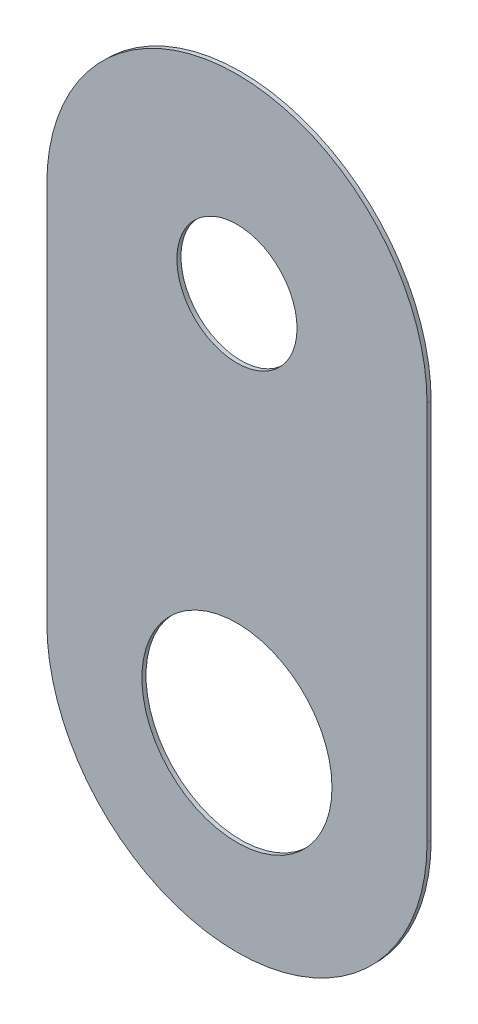
ISO-10303-21;
HEADER;
FILE_DESCRIPTION(('STEP AP214'),'2;1');
FILE_NAME('part.step','',(''),(''),'','','');
FILE_SCHEMA(('AUTOMOTIVE_DESIGN { 1 0 10303 214 1 1 1 1 }'));
ENDSEC;
DATA;
#1=APPLICATION_CONTEXT('core data for automotive mechanical design processes');
#2=APPLICATION_PROTOCOL_DEFINITION('international standard','automotive_design',2000,#1);
#3=PRODUCT_CONTEXT('',#1,'mechanical');
#4=PRODUCT('Part','Part','',(#3));
#5=PRODUCT_RELATED_PRODUCT_CATEGORY('part','',(#4));
#6=PRODUCT_DEFINITION_FORMATION('','',#4);
#7=PRODUCT_DEFINITION_CONTEXT('part definition',#1,'design');
#8=PRODUCT_DEFINITION('design','',#6,#7);
#9=PRODUCT_DEFINITION_SHAPE('','',#8);
#10=(LENGTH_UNIT() NAMED_UNIT(*) SI_UNIT(.MILLI.,.METRE.));
#11=(NAMED_UNIT(*) PLANE_ANGLE_UNIT() SI_UNIT($,.RADIAN.));
#12=(NAMED_UNIT(*) SI_UNIT($,.STERADIAN.) SOLID_ANGLE_UNIT());
#13=UNCERTAINTY_MEASURE_WITH_UNIT(LENGTH_MEASURE(1.E-05),#10,'distance_accuracy_value','');
#14=(GEOMETRIC_REPRESENTATION_CONTEXT(3) GLOBAL_UNCERTAINTY_ASSIGNED_CONTEXT((#13)) GLOBAL_UNIT_ASSIGNED_CONTEXT((#10,
#11,#12)) REPRESENTATION_CONTEXT('',''));
#15=CARTESIAN_POINT('',(0.,0.,0.));
#16=DIRECTION('',(0.,0.,1.));
#17=DIRECTION('',(1.,0.,0.));
#18=AXIS2_PLACEMENT_3D('',#15,#16,#17);
#19=CARTESIAN_POINT('',(25.4,0.,0.549916313462303));
#20=DIRECTION('',(0.,0.,-1.));
#21=DIRECTION('',(-1.,0.,0.));
#22=AXIS2_PLACEMENT_3D('',#19,#20,#21);
#23=CYLINDRICAL_SURFACE('',#22,25.4);
#24=CARTESIAN_POINT('',(25.4,0.,0.));
#25=DIRECTION('',(0.,0.,1.));
#26=DIRECTION('',(-1.,0.,0.));
#27=AXIS2_PLACEMENT_3D('',#24,#25,#26);
#28=CIRCLE('',#27,25.4);
#29=CARTESIAN_POINT('',(0.,0.,0.));
#30=VERTEX_POINT('',#29);
#31=CARTESIAN_POINT('',(50.8,0.,0.));
#32=VERTEX_POINT('',#31);
#33=EDGE_CURVE('E111',#30,#32,#28,.T.);
#34=ORIENTED_EDGE('',*,*,#33,.T.);
#35=DIRECTION('',(0.,0.,-1.));
#36=VECTOR('',#35,1.);
#37=CARTESIAN_POINT('',(50.8,0.,0.549916313462303));
#38=LINE('',#37,#36);
#39=CARTESIAN_POINT('',(50.8,0.,0.549916313462303));
#40=VERTEX_POINT('',#39);
#41=EDGE_CURVE('E11',#40,#32,#38,.T.);
#42=ORIENTED_EDGE('',*,*,#41,.F.);
#43=CARTESIAN_POINT('',(25.4,0.,0.549916313462303));
#44=DIRECTION('',(0.,0.,1.));
#45=DIRECTION('',(-1.,0.,0.));
#46=AXIS2_PLACEMENT_3D('',#43,#44,#45);
#47=CIRCLE('',#46,25.4);
#48=CARTESIAN_POINT('',(0.,0.,0.549916313462303));
#49=VERTEX_POINT('',#48);
#50=EDGE_CURVE('E94',#49,#40,#47,.T.);
#51=ORIENTED_EDGE('',*,*,#50,.F.);
#52=DIRECTION('',(0.,0.,-1.));
#53=VECTOR('',#52,1.);
#54=CARTESIAN_POINT('',(0.,0.,0.549916313462303));
#55=LINE('',#54,#53);
#56=EDGE_CURVE('E107',#49,#30,#55,.T.);
#57=ORIENTED_EDGE('',*,*,#56,.T.);
#58=EDGE_LOOP('',(#34,#42,#51,#57));
#59=FACE_BOUND('',#58,.T.);
#60=ADVANCED_FACE('F42',(#59),#23,.T.);
#61=CARTESIAN_POINT('',(50.8,50.8,0.549916313462303));
#62=DIRECTION('',(-1.,0.,0.));
#63=DIRECTION('',(0.,-1.,0.));
#64=AXIS2_PLACEMENT_3D('',#61,#62,#63);
#65=PLANE('',#64);
#66=DIRECTION('',(0.,1.,0.));
#67=VECTOR('',#66,1.);
#68=CARTESIAN_POINT('',(50.8,50.8,0.));
#69=LINE('',#68,#67);
#70=CARTESIAN_POINT('',(50.8,50.8,0.));
#71=VERTEX_POINT('',#70);
#72=EDGE_CURVE('E99',#32,#71,#69,.T.);
#73=ORIENTED_EDGE('',*,*,#72,.T.);
#74=DIRECTION('',(0.,0.,-1.));
#75=VECTOR('',#74,1.);
#76=CARTESIAN_POINT('',(50.8,50.8,0.549916313462303));
#77=LINE('',#76,#75);
#78=CARTESIAN_POINT('',(50.8,50.8,0.549916313462303));
#79=VERTEX_POINT('',#78);
#80=EDGE_CURVE('E51',#79,#71,#77,.T.);
#81=ORIENTED_EDGE('',*,*,#80,.F.);
#82=DIRECTION('',(0.,1.,0.));
#83=VECTOR('',#82,1.);
#84=CARTESIAN_POINT('',(50.8,50.8,0.549916313462303));
#85=LINE('',#84,#83);
#86=EDGE_CURVE('E89',#40,#79,#85,.T.);
#87=ORIENTED_EDGE('',*,*,#86,.F.);
#88=ORIENTED_EDGE('',*,*,#41,.T.);
#89=EDGE_LOOP('',(#73,#81,#87,#88));
#90=FACE_BOUND('',#89,.T.);
#91=ADVANCED_FACE('F98',(#90),#65,.F.);
#92=CARTESIAN_POINT('',(25.4,50.8,0.549916313462303));
#93=DIRECTION('',(0.,0.,-1.));
#94=DIRECTION('',(-1.,0.,0.));
#95=AXIS2_PLACEMENT_3D('',#92,#93,#94);
#96=CYLINDRICAL_SURFACE('',#95,25.4);
#97=CARTESIAN_POINT('',(25.4,50.8,0.));
#98=DIRECTION('',(0.,0.,1.));
#99=DIRECTION('',(-1.,0.,0.));
#100=AXIS2_PLACEMENT_3D('',#97,#98,#99);
#101=CIRCLE('',#100,25.4);
#102=CARTESIAN_POINT('',(0.,50.8,0.));
#103=VERTEX_POINT('',#102);
#104=EDGE_CURVE('E76',#71,#103,#101,.T.);
#105=ORIENTED_EDGE('',*,*,#104,.T.);
#106=DIRECTION('',(0.,0.,-1.));
#107=VECTOR('',#106,1.);
#108=CARTESIAN_POINT('',(0.,50.8,0.549916313462303));
#109=LINE('',#108,#107);
#110=CARTESIAN_POINT('',(0.,50.8,0.549916313462303));
#111=VERTEX_POINT('',#110);
#112=EDGE_CURVE('E101',#111,#103,#109,.T.);
#113=ORIENTED_EDGE('',*,*,#112,.F.);
#114=CARTESIAN_POINT('',(25.4,50.8,0.549916313462303));
#115=DIRECTION('',(0.,0.,1.));
#116=DIRECTION('',(-1.,0.,0.));
#117=AXIS2_PLACEMENT_3D('',#114,#115,#116);
#118=CIRCLE('',#117,25.4);
#119=EDGE_CURVE('E92',#79,#111,#118,.T.);
#120=ORIENTED_EDGE('',*,*,#119,.F.);
#121=ORIENTED_EDGE('',*,*,#80,.T.);
#122=EDGE_LOOP('',(#105,#113,#120,#121));
#123=FACE_BOUND('',#122,.T.);
#124=ADVANCED_FACE('F102',(#123),#96,.T.);
#125=CARTESIAN_POINT('',(0.,0.,0.549916313462303));
#126=DIRECTION('',(1.,0.,0.));
#127=DIRECTION('',(0.,1.,0.));
#128=AXIS2_PLACEMENT_3D('',#125,#126,#127);
#129=PLANE('',#128);
#130=DIRECTION('',(0.,-1.,0.));
#131=VECTOR('',#130,1.);
#132=CARTESIAN_POINT('',(0.,0.,0.));
#133=LINE('',#132,#131);
#134=EDGE_CURVE('E82',#103,#30,#133,.T.);
#135=ORIENTED_EDGE('',*,*,#134,.T.);
#136=ORIENTED_EDGE('',*,*,#56,.F.);
#137=DIRECTION('',(0.,-1.,0.));
#138=VECTOR('',#137,1.);
#139=CARTESIAN_POINT('',(0.,0.,0.549916313462303));
#140=LINE('',#139,#138);
#141=EDGE_CURVE('E59',#111,#49,#140,.T.);
#142=ORIENTED_EDGE('',*,*,#141,.F.);
#143=ORIENTED_EDGE('',*,*,#112,.T.);
#144=EDGE_LOOP('',(#135,#136,#142,#143));
#145=FACE_BOUND('',#144,.T.);
#146=ADVANCED_FACE('F126',(#145),#129,.F.);
#147=CARTESIAN_POINT('',(25.4,0.,0.549916313462303));
#148=DIRECTION('',(0.,0.,-1.));
#149=DIRECTION('',(-1.,0.,0.));
#150=AXIS2_PLACEMENT_3D('',#147,#148,#149);
#151=PLANE('',#150);
#152=CARTESIAN_POINT('',(25.4,0.,0.549916313462303));
#153=DIRECTION('',(0.,0.,1.));
#154=DIRECTION('',(1.,0.,0.));
#155=AXIS2_PLACEMENT_3D('',#152,#153,#154);
#156=CIRCLE('',#155,12.7);
#157=CARTESIAN_POINT('',(38.1,0.,0.549916313462303));
#158=VERTEX_POINT('',#157);
#159=EDGE_CURVE('E142',#158,#158,#156,.T.);
#160=ORIENTED_EDGE('',*,*,#159,.F.);
#161=EDGE_LOOP('',(#160));
#162=FACE_BOUND('',#161,.T.);
#163=CARTESIAN_POINT('',(25.4,50.8,0.549916313462303));
#164=DIRECTION('',(0.,0.,1.));
#165=DIRECTION('',(1.,0.,0.));
#166=AXIS2_PLACEMENT_3D('',#163,#164,#165);
#167=CIRCLE('',#166,8.0264);
#168=CARTESIAN_POINT('',(33.4264,50.8,0.549916313462303));
#169=VERTEX_POINT('',#168);
#170=EDGE_CURVE('E138',#169,#169,#167,.T.);
#171=ORIENTED_EDGE('',*,*,#170,.F.);
#172=EDGE_LOOP('',(#171));
#173=FACE_BOUND('',#172,.T.);
#174=ORIENTED_EDGE('',*,*,#50,.T.);
#175=ORIENTED_EDGE('',*,*,#86,.T.);
#176=ORIENTED_EDGE('',*,*,#119,.T.);
#177=ORIENTED_EDGE('',*,*,#141,.T.);
#178=EDGE_LOOP('',(#174,#175,#176,#177));
#179=FACE_BOUND('',#178,.T.);
#180=ADVANCED_FACE('F90',(#162,#173,#179),#151,.F.);
#181=CARTESIAN_POINT('',(25.4,0.,0.));
#182=DIRECTION('',(0.,0.,-1.));
#183=DIRECTION('',(-1.,0.,0.));
#184=AXIS2_PLACEMENT_3D('',#181,#182,#183);
#185=PLANE('',#184);
#186=CARTESIAN_POINT('',(25.4,0.,0.));
#187=DIRECTION('',(0.,0.,1.));
#188=DIRECTION('',(1.,0.,0.));
#189=AXIS2_PLACEMENT_3D('',#186,#187,#188);
#190=CIRCLE('',#189,12.7);
#191=CARTESIAN_POINT('',(38.1,0.,0.));
#192=VERTEX_POINT('',#191);
#193=EDGE_CURVE('E115',#192,#192,#190,.T.);
#194=ORIENTED_EDGE('',*,*,#193,.T.);
#195=EDGE_LOOP('',(#194));
#196=FACE_BOUND('',#195,.T.);
#197=CARTESIAN_POINT('',(25.4,50.8,0.));
#198=DIRECTION('',(0.,0.,1.));
#199=DIRECTION('',(1.,0.,0.));
#200=AXIS2_PLACEMENT_3D('',#197,#198,#199);
#201=CIRCLE('',#200,8.0264);
#202=CARTESIAN_POINT('',(33.4264,50.8,0.));
#203=VERTEX_POINT('',#202);
#204=EDGE_CURVE('E134',#203,#203,#201,.T.);
#205=ORIENTED_EDGE('',*,*,#204,.T.);
#206=EDGE_LOOP('',(#205));
#207=FACE_BOUND('',#206,.T.);
#208=ORIENTED_EDGE('',*,*,#33,.F.);
#209=ORIENTED_EDGE('',*,*,#134,.F.);
#210=ORIENTED_EDGE('',*,*,#104,.F.);
#211=ORIENTED_EDGE('',*,*,#72,.F.);
#212=EDGE_LOOP('',(#208,#209,#210,#211));
#213=FACE_BOUND('',#212,.T.);
#214=ADVANCED_FACE('F129',(#196,#207,#213),#185,.T.);
#215=CARTESIAN_POINT('',(25.4,50.8,0.));
#216=DIRECTION('',(0.,0.,1.));
#217=DIRECTION('',(1.,0.,0.));
#218=AXIS2_PLACEMENT_3D('',#215,#216,#217);
#219=CYLINDRICAL_SURFACE('',#218,8.0264);
#220=ORIENTED_EDGE('',*,*,#204,.F.);
#221=EDGE_LOOP('',(#220));
#222=FACE_BOUND('',#221,.T.);
#223=ORIENTED_EDGE('',*,*,#170,.T.);
#224=EDGE_LOOP('',(#223));
#225=FACE_BOUND('',#224,.T.);
#226=ADVANCED_FACE('F156',(#222,#225),#219,.F.);
#227=CARTESIAN_POINT('',(25.4,0.,0.));
#228=DIRECTION('',(0.,0.,1.));
#229=DIRECTION('',(1.,0.,0.));
#230=AXIS2_PLACEMENT_3D('',#227,#228,#229);
#231=CYLINDRICAL_SURFACE('',#230,12.7);
#232=ORIENTED_EDGE('',*,*,#193,.F.);
#233=EDGE_LOOP('',(#232));
#234=FACE_BOUND('',#233,.T.);
#235=ORIENTED_EDGE('',*,*,#159,.T.);
#236=EDGE_LOOP('',(#235));
#237=FACE_BOUND('',#236,.T.);
#238=ADVANCED_FACE('F153',(#234,#237),#231,.F.);
#239=CLOSED_SHELL('',(#60,#91,#124,#146,#180,#214,#226,#238));
#240=MANIFOLD_SOLID_BREP('B2',#239);
#241=ADVANCED_BREP_SHAPE_REPRESENTATION('',(#18,#240),#14);
#242=SHAPE_DEFINITION_REPRESENTATION(#9,#241);
ENDSEC;
END-ISO-10303-21;
